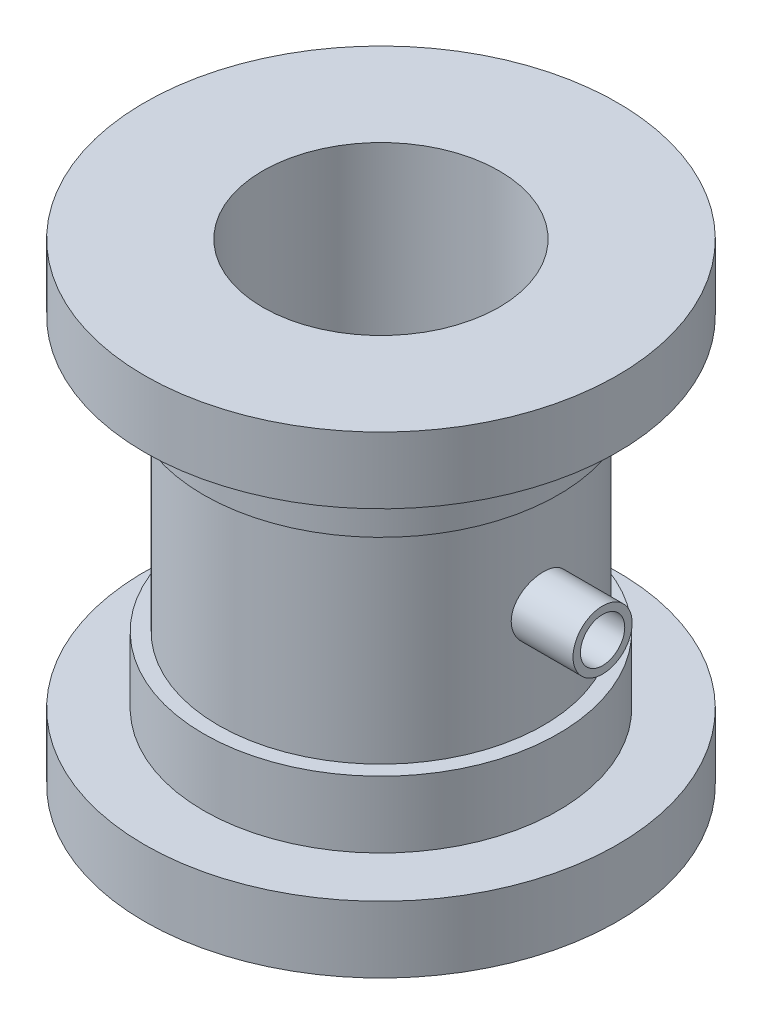
ISO-10303-21;
HEADER;
FILE_DESCRIPTION(('STEP AP214'),'2;1');
FILE_NAME('part.step','',(''),(''),'','','');
FILE_SCHEMA(('AUTOMOTIVE_DESIGN { 1 0 10303 214 1 1 1 1 }'));
ENDSEC;
DATA;
#1=APPLICATION_CONTEXT('core data for automotive mechanical design processes');
#2=APPLICATION_PROTOCOL_DEFINITION('international standard','automotive_design',2000,#1);
#3=PRODUCT_CONTEXT('',#1,'mechanical');
#4=PRODUCT('Part','Part','',(#3));
#5=PRODUCT_RELATED_PRODUCT_CATEGORY('part','',(#4));
#6=PRODUCT_DEFINITION_FORMATION('','',#4);
#7=PRODUCT_DEFINITION_CONTEXT('part definition',#1,'design');
#8=PRODUCT_DEFINITION('design','',#6,#7);
#9=PRODUCT_DEFINITION_SHAPE('','',#8);
#10=(LENGTH_UNIT() NAMED_UNIT(*) SI_UNIT(.MILLI.,.METRE.));
#11=(NAMED_UNIT(*) PLANE_ANGLE_UNIT() SI_UNIT($,.RADIAN.));
#12=(NAMED_UNIT(*) SI_UNIT($,.STERADIAN.) SOLID_ANGLE_UNIT());
#13=UNCERTAINTY_MEASURE_WITH_UNIT(LENGTH_MEASURE(1.E-05),#10,'distance_accuracy_value','');
#14=(GEOMETRIC_REPRESENTATION_CONTEXT(3) GLOBAL_UNCERTAINTY_ASSIGNED_CONTEXT((#13)) GLOBAL_UNIT_ASSIGNED_CONTEXT((#10,
#11,#12)) REPRESENTATION_CONTEXT('',''));
#15=CARTESIAN_POINT('',(0.,0.,0.));
#16=DIRECTION('',(0.,0.,1.));
#17=DIRECTION('',(1.,0.,0.));
#18=AXIS2_PLACEMENT_3D('',#15,#16,#17);
#19=CARTESIAN_POINT('',(0.,28.,0.));
#20=DIRECTION('',(0.,-1.,0.));
#21=DIRECTION('',(0.,0.,-1.));
#22=AXIS2_PLACEMENT_3D('',#19,#20,#21);
#23=CYLINDRICAL_SURFACE('',#22,22.);
#24=CARTESIAN_POINT('',(-21.7944947177034,14.,-3.));
#25=CARTESIAN_POINT('',(-21.7944973125222,14.1676686557939,-2.99999295397829));
#26=CARTESIAN_POINT('',(-21.7964504822141,14.335438885572,-2.98589613516892));
#27=CARTESIAN_POINT('',(-21.8040481680046,14.6663009494034,-2.92988930626152));
#28=CARTESIAN_POINT('',(-21.8096964302678,14.8293878600565,-2.88795106929477));
#29=CARTESIAN_POINT('',(-21.8240329226108,15.1460455710164,-2.77752885626791));
#30=CARTESIAN_POINT('',(-21.8327189725423,15.2996231031868,-2.70906391400626));
#31=CARTESIAN_POINT('',(-21.8521497354893,15.593083937498,-2.54757436301586));
#32=CARTESIAN_POINT('',(-21.8628941262462,15.7329693781315,-2.4545535979434));
#33=CARTESIAN_POINT('',(-21.8853107439761,15.9960291899694,-2.24593261550096));
#34=CARTESIAN_POINT('',(-21.8969880962733,16.1190995206715,-2.13020174404838));
#35=CARTESIAN_POINT('',(-21.9199089625179,16.3441356113716,-1.87972745186893));
#36=CARTESIAN_POINT('',(-21.9311524538967,16.446100274685,-1.74498304377951));
#37=CARTESIAN_POINT('',(-21.9519917823356,16.6264088097933,-1.45964673364285));
#38=CARTESIAN_POINT('',(-21.9615809332171,16.7046577531438,-1.30899431491147));
#39=CARTESIAN_POINT('',(-21.9779746087792,16.8347051362175,-0.996533559622196));
#40=CARTESIAN_POINT('',(-21.9847792556648,16.8865047367613,-0.834725713012597));
#41=CARTESIAN_POINT('',(-21.9948010960819,16.9618700639319,-0.505615027627407));
#42=CARTESIAN_POINT('',(-21.9980403391051,16.9856093917029,-0.338352625202421));
#43=CARTESIAN_POINT('',(-22.0006418160325,17.0047187619281,-0.00218901989865322));
#44=CARTESIAN_POINT('',(-22.0000042297454,17.0000901200993,0.16671210661274));
#45=CARTESIAN_POINT('',(-21.9949416293269,16.9627331448272,0.500176134095491));
#46=CARTESIAN_POINT('',(-21.9905417842193,16.9301915409683,0.664760389901238));
#47=CARTESIAN_POINT('',(-21.9784771616625,16.8382247979685,0.98610996865958));
#48=CARTESIAN_POINT('',(-21.9708123123852,16.7787990673916,1.1428751195119));
#49=CARTESIAN_POINT('',(-21.9530355245634,16.6345555950203,1.44470900216683));
#50=CARTESIAN_POINT('',(-21.9429159096715,16.5496579984127,1.58973910165001));
#51=CARTESIAN_POINT('',(-21.9213599095811,16.356938901094,1.86356465940336));
#52=CARTESIAN_POINT('',(-21.9099234526045,16.2491161505149,1.99235923191069));
#53=CARTESIAN_POINT('',(-21.8869019715346,16.0125639881594,2.23115639122851));
#54=CARTESIAN_POINT('',(-21.8753164955576,15.883671704982,2.34099765683572));
#55=CARTESIAN_POINT('',(-21.8533940433535,15.6091960813263,2.53751386076589));
#56=CARTESIAN_POINT('',(-21.8430570725053,15.4636126689425,2.62418869928229));
#57=CARTESIAN_POINT('',(-21.8248023099056,15.159733098398,2.77192629130127));
#58=CARTESIAN_POINT('',(-21.816885888441,15.0014298032314,2.83297454471217));
#59=CARTESIAN_POINT('',(-21.8043941534575,14.6766859388551,2.92757469616753));
#60=CARTESIAN_POINT('',(-21.7998186470391,14.5102458400451,2.96112818173423));
#61=CARTESIAN_POINT('',(-21.7945626889125,14.1753823129862,2.99956941672119));
#62=CARTESIAN_POINT('',(-21.7938512929769,14.006985496761,3.00468490854897));
#63=CARTESIAN_POINT('',(-21.7963221316711,13.6717371641336,2.98670732293099));
#64=CARTESIAN_POINT('',(-21.7995042670648,13.5048856084559,2.96361496443094));
#65=CARTESIAN_POINT('',(-21.8093753071634,13.1781565348422,2.89006955453774));
#66=CARTESIAN_POINT('',(-21.8160498979624,13.0182534145076,2.83972815512375));
#67=CARTESIAN_POINT('',(-21.8321421092609,12.7091565507405,2.71322912313733));
#68=CARTESIAN_POINT('',(-21.8415598432741,12.5599632508084,2.63707042220062));
#69=CARTESIAN_POINT('',(-21.8621508077798,12.2754947875546,2.46054424209315));
#70=CARTESIAN_POINT('',(-21.8733346554527,12.1403125677473,2.36002824545063));
#71=CARTESIAN_POINT('',(-21.8961649833416,11.8886549951313,2.13784918546698));
#72=CARTESIAN_POINT('',(-21.9078114850387,11.7721805121982,2.01618513932771));
#73=CARTESIAN_POINT('',(-21.9303506440045,11.5604369463813,1.75416517490271));
#74=CARTESIAN_POINT('',(-21.9412376115705,11.465318071075,1.61368731048535));
#75=CARTESIAN_POINT('',(-21.9609445601932,11.3000282219224,1.31861563564173));
#76=CARTESIAN_POINT('',(-21.9697645895377,11.2298566652379,1.1640221551012));
#77=CARTESIAN_POINT('',(-21.9843187797623,11.1166979481429,0.845593617063882));
#78=CARTESIAN_POINT('',(-21.9900625555325,11.0736260127071,0.681789143548597));
#79=CARTESIAN_POINT('',(-21.9978571930975,11.0156139846478,0.349189125621002));
#80=CARTESIAN_POINT('',(-21.9999082547485,11.0006723695607,0.180393851822023));
#81=CARTESIAN_POINT('',(-22.0000849669784,10.9993773344575,-0.15593394479378));
#82=CARTESIAN_POINT('',(-21.9982423123403,11.0127930862346,-0.323465608546993));
#83=CARTESIAN_POINT('',(-21.9909020074537,11.0673405312772,-0.65386852750444));
#84=CARTESIAN_POINT('',(-21.9854043633727,11.1084721777741,-0.816739790572315));
#85=CARTESIAN_POINT('',(-21.9713688879314,11.2172071855912,-1.13315387765859));
#86=CARTESIAN_POINT('',(-21.9628325744139,11.2847973323295,-1.28670131426867));
#87=CARTESIAN_POINT('',(-21.9436616719154,11.4445066044813,-1.58031159285156));
#88=CARTESIAN_POINT('',(-21.9330270390184,11.5366262432889,-1.72037415250692));
#89=CARTESIAN_POINT('',(-21.9107413064255,11.7436255734436,-1.98421472860386));
#90=CARTESIAN_POINT('',(-21.899082951343,11.8586765359164,-2.10785776937319));
#91=CARTESIAN_POINT('',(-21.8761200052605,12.1079137559864,-2.33416948478685));
#92=CARTESIAN_POINT('',(-21.864815498298,12.2421045177904,-2.43683320845295));
#93=CARTESIAN_POINT('',(-21.8437846234674,12.5265296933573,-2.61868613380124));
#94=CARTESIAN_POINT('',(-21.8340657568726,12.6768350915978,-2.69776514213643));
#95=CARTESIAN_POINT('',(-21.817394367016,12.9886475846397,-2.8294429199818));
#96=CARTESIAN_POINT('',(-21.8104388960614,13.1501425264417,-2.88206992162081));
#97=CARTESIAN_POINT('',(-21.8017355288375,13.427022796486,-2.94703203226377));
#98=CARTESIAN_POINT('',(-21.7990341203125,13.5406764223968,-2.96686567785599));
#99=CARTESIAN_POINT('',(-21.7954128315745,13.7695373771214,-2.99335201931175));
#100=CARTESIAN_POINT('',(-21.7944929340268,13.8847446908061,-3.00000484343008));
#101=CARTESIAN_POINT('',(-21.7944947177034,14.,-3.));
#102=B_SPLINE_CURVE_WITH_KNOTS('',3,(#24,#25,#26,#27,#28,#29,#30,#31,#32,#33,#34,#35,#36,#37,
#38,#39,#40,#41,#42,#43,#44,#45,#46,#47,#48,#49,#50,#51,#52,#53,#54,#55,#56,#57,#58,#59,#60,#61,
#62,#63,#64,#65,#66,#67,#68,#69,#70,#71,#72,#73,#74,#75,#76,#77,#78,#79,#80,#81,#82,#83,#84,#85,
#86,#87,#88,#89,#90,#91,#92,#93,#94,#95,#96,#97,#98,#99,#100,#101),.UNSPECIFIED.,.T.,.F.,(4,2,2,
2,2,2,2,2,2,2,2,2,2,2,2,2,2,2,2,2,2,2,2,2,2,2,2,2,2,2,2,2,2,2,2,2,2,2,4),(0.,0.502584827322538,
1.00567997726412,1.50841480614355,2.01107098991681,2.5167086035308,3.02237248429928,
3.5300344705254,4.03767417433728,4.54215653413514,5.04661549603351,5.54772586150296,
6.04884725166254,6.55155638132181,7.05429292546104,7.56111742626901,8.06794411056386,
8.57505718337533,9.08214097388763,9.58515792757104,10.0881620609109,10.5891205844916,
11.0900998411272,11.5942142584276,12.0983521093423,12.6059319233779,13.1134998781727,
13.6194720220333,14.125416780985,14.6272590296531,15.1291004314969,15.6306915099824,
16.1322930874248,16.6377918045005,17.1434096784681,17.6513541852326,18.158755407386,
18.5042352052812,18.8497116414995),.UNSPECIFIED.);
#103=CARTESIAN_POINT('',(-21.7944947177034,14.,-3.));
#104=VERTEX_POINT('',#103);
#105=EDGE_CURVE('E90',#104,#104,#102,.T.);
#106=ORIENTED_EDGE('',*,*,#105,.T.);
#107=EDGE_LOOP('',(#106));
#108=FACE_BOUND('',#107,.T.);
#109=CARTESIAN_POINT('',(0.,28.,0.));
#110=DIRECTION('',(0.,1.,0.));
#111=DIRECTION('',(0.,0.,1.));
#112=AXIS2_PLACEMENT_3D('',#109,#110,#111);
#113=CIRCLE('',#112,22.);
#114=CARTESIAN_POINT('',(0.,28.,22.));
#115=VERTEX_POINT('',#114);
#116=EDGE_CURVE('E41',#115,#115,#113,.T.);
#117=ORIENTED_EDGE('',*,*,#116,.F.);
#118=EDGE_LOOP('',(#117));
#119=FACE_BOUND('',#118,.T.);
#120=CARTESIAN_POINT('',(0.,0.,0.));
#121=DIRECTION('',(0.,1.,0.));
#122=DIRECTION('',(0.,0.,1.));
#123=AXIS2_PLACEMENT_3D('',#120,#121,#122);
#124=CIRCLE('',#123,22.);
#125=CARTESIAN_POINT('',(0.,0.,22.));
#126=VERTEX_POINT('',#125);
#127=EDGE_CURVE('E119',#126,#126,#124,.T.);
#128=ORIENTED_EDGE('',*,*,#127,.T.);
#129=EDGE_LOOP('',(#128));
#130=FACE_BOUND('',#129,.T.);
#131=CARTESIAN_POINT('',(21.6333076527839,14.,4.));
#132=CARTESIAN_POINT('',(21.6333118939645,13.7773197548541,3.99999133497668));
#133=CARTESIAN_POINT('',(21.636783172832,13.554525617424,3.98134200846101));
#134=CARTESIAN_POINT('',(21.650277261808,13.1152107682541,3.907282639324));
#135=CARTESIAN_POINT('',(21.6603057667963,12.8986956806614,3.85184064204138));
#136=CARTESIAN_POINT('',(21.6857418061113,12.478359373963,3.70594738579437));
#137=CARTESIAN_POINT('',(21.7011444752348,12.2745268693839,3.61552778385547));
#138=CARTESIAN_POINT('',(21.7355875966023,11.8849402167421,3.40232850816631));
#139=CARTESIAN_POINT('',(21.7546277295314,11.6991844839672,3.27955167453961));
#140=CARTESIAN_POINT('',(21.7944494758657,11.3488331051165,3.00359049647932));
#141=CARTESIAN_POINT('',(21.8152472612912,11.1844798515321,2.85010070695621));
#142=CARTESIAN_POINT('',(21.8560978635286,10.8837088743311,2.51773079268323));
#143=CARTESIAN_POINT('',(21.8761506327525,10.7472929327092,2.33884904952699));
#144=CARTESIAN_POINT('',(21.9134244798488,10.5053453630995,1.95918683799973));
#145=CARTESIAN_POINT('',(21.930624292806,10.4000414600084,1.75825898095977));
#146=CARTESIAN_POINT('',(21.9600735467303,10.2247733339477,1.34119954887522));
#147=CARTESIAN_POINT('',(21.9723233703801,10.1548063789813,1.12506915065336));
#148=CARTESIAN_POINT('',(21.9903782117666,10.0529455334891,0.686249675641715));
#149=CARTESIAN_POINT('',(21.9962522909049,10.0206433713586,0.463658257037535));
#150=CARTESIAN_POINT('',(22.0011316177893,9.9937576650752,0.0161429459318481));
#151=CARTESIAN_POINT('',(22.0001374169679,9.99917109285692,-0.208780757870077));
#152=CARTESIAN_POINT('',(21.9914463710423,10.0472482841558,-0.651778392281481));
#153=CARTESIAN_POINT('',(21.9838286175382,10.0894725070289,-0.8699018001067));
#154=CARTESIAN_POINT('',(21.9628349381595,10.209278394923,-1.29591498120673));
#155=CARTESIAN_POINT('',(21.949458811838,10.2868612907725,-1.50380439795921));
#156=CARTESIAN_POINT('',(21.9183184074471,10.4756061195583,-1.9047324509077));
#157=CARTESIAN_POINT('',(21.9005310604676,10.5869452880677,-2.09768578503493));
#158=CARTESIAN_POINT('',(21.8625379364345,10.8399117798494,-2.46233526714585));
#159=CARTESIAN_POINT('',(21.8423319276856,10.981542005871,-2.63402937539644));
#160=CARTESIAN_POINT('',(21.8013981618568,11.2934969091586,-2.95388890108789));
#161=CARTESIAN_POINT('',(21.7806670830423,11.464206035838,-3.10167918809898));
#162=CARTESIAN_POINT('',(21.7412992413716,11.8281881278418,-3.36658543928332));
#163=CARTESIAN_POINT('',(21.7226625056581,12.0214613855305,-3.48370100593934));
#164=CARTESIAN_POINT('',(21.6895894681967,12.4255650209737,-3.68403076498185));
#165=CARTESIAN_POINT('',(21.6751596002547,12.6364216632796,-3.76719310770445));
#166=CARTESIAN_POINT('',(21.6522346695387,13.0694348997767,-3.89680753773996));
#167=CARTESIAN_POINT('',(21.6437389774287,13.2915902930223,-3.94326351793351));
#168=CARTESIAN_POINT('',(21.6337680818549,13.7375196024108,-3.99760435703092));
#169=CARTESIAN_POINT('',(21.6321950076555,13.9612258653393,-4.00602696978329));
#170=CARTESIAN_POINT('',(21.6359859030778,14.4068491011222,-3.98550109557699));
#171=CARTESIAN_POINT('',(21.6413495511773,14.6287661564279,-3.95655434071577));
#172=CARTESIAN_POINT('',(21.6583185875735,15.0627606881046,-3.86257219277794));
#173=CARTESIAN_POINT('',(21.6698756001577,15.2749007680161,-3.79781637710752));
#174=CARTESIAN_POINT('',(21.6978878160151,15.6853194376569,-3.63434995143755));
#175=CARTESIAN_POINT('',(21.7143433613546,15.8835970581714,-3.53563697012216));
#176=CARTESIAN_POINT('',(21.7505226830533,16.2630383920305,-3.30581172375987));
#177=CARTESIAN_POINT('',(21.7702800968595,16.4439922361688,-3.17435835883133));
#178=CARTESIAN_POINT('',(21.8107413258404,16.7814673831955,-2.88324609901472));
#179=CARTESIAN_POINT('',(21.8314452207,16.9379866239993,-2.72358482602649));
#180=CARTESIAN_POINT('',(21.8717797209063,17.2241456922996,-2.37819260014522));
#181=CARTESIAN_POINT('',(21.8913936565351,17.3534247107236,-2.19216046504753));
#182=CARTESIAN_POINT('',(21.9270616275553,17.578892612166,-1.80070523958705));
#183=CARTESIAN_POINT('',(21.9431157941211,17.6750827145543,-1.59528286413569));
#184=CARTESIAN_POINT('',(21.9697834526315,17.8310960772729,-1.17189643669068));
#185=CARTESIAN_POINT('',(21.9804239020959,17.8910998097531,-0.954000658707898));
#186=CARTESIAN_POINT('',(21.9951799495618,17.9736146865943,-0.511013297926956));
#187=CARTESIAN_POINT('',(21.9992961913554,17.9961295302734,-0.285922427358459));
#188=CARTESIAN_POINT('',(22.0005282842776,18.002905042211,0.161599238057637));
#189=CARTESIAN_POINT('',(21.9977440646224,17.9877117769694,0.384021675850898));
#190=CARTESIAN_POINT('',(21.9856946780428,17.9206941071521,0.823089077981736));
#191=CARTESIAN_POINT('',(21.9764295654387,17.868870009602,1.03973409072766));
#192=CARTESIAN_POINT('',(21.9524581381546,17.7302861930215,1.46083086688087));
#193=CARTESIAN_POINT('',(21.9377603669599,17.6435813092489,1.6653011932924));
#194=CARTESIAN_POINT('',(21.9045184478405,17.4377611943825,2.05687402388434));
#195=CARTESIAN_POINT('',(21.8859740630709,17.3186439674452,2.2439754575947));
#196=CARTESIAN_POINT('',(21.8467718041457,17.0494847228762,2.59822919507097));
#197=CARTESIAN_POINT('',(21.826088758947,16.8990466092313,2.76507779716897));
#198=CARTESIAN_POINT('',(21.7851034058444,16.5723409666129,3.07135244710173));
#199=CARTESIAN_POINT('',(21.7648011884524,16.3960673828768,3.21077204872679));
#200=CARTESIAN_POINT('',(21.7266856567864,16.0208806487978,3.45935343607217));
#201=CARTESIAN_POINT('',(21.7088952940926,15.8217855213773,3.56824417003713));
#202=CARTESIAN_POINT('',(21.6780923491353,15.407873446548,3.75086117813966));
#203=CARTESIAN_POINT('',(21.6650751844592,15.1930718167844,3.82462119925559));
#204=CARTESIAN_POINT('',(21.6480562150115,14.8146466311355,3.91959792411038));
#205=CARTESIAN_POINT('',(21.642557744208,14.6532614747828,3.94969798379532));
#206=CARTESIAN_POINT('',(21.6351819455147,14.3279380959356,3.98990196850047));
#207=CARTESIAN_POINT('',(21.6333045292318,14.1639999358607,4.00000638163151));
#208=CARTESIAN_POINT('',(21.6333076527839,14.,4.));
#209=B_SPLINE_CURVE_WITH_KNOTS('',3,(#131,#132,#133,#134,#135,#136,#137,#138,#139,#140,#141,
#142,#143,#144,#145,#146,#147,#148,#149,#150,#151,#152,#153,#154,#155,#156,#157,#158,#159,#160,
#161,#162,#163,#164,#165,#166,#167,#168,#169,#170,#171,#172,#173,#174,#175,#176,#177,#178,#179,
#180,#181,#182,#183,#184,#185,#186,#187,#188,#189,#190,#191,#192,#193,#194,#195,#196,#197,#198,
#199,#200,#201,#202,#203,#204,#205,#206,#207,#208),.UNSPECIFIED.,.T.,.F.,(4,2,2,2,2,2,2,2,2,2,2,
2,2,2,2,2,2,2,2,2,2,2,2,2,2,2,2,2,2,2,2,2,2,2,2,2,2,2,4),(0.,0.667440705257541,1.33546184685072,
2.00287979476302,2.67023918023371,3.3445987023052,4.01900122532956,4.69822425023956,
5.3773947545028,6.04913278831927,6.72081689103461,7.38458890585934,8.04838402822076,
8.71572656975959,9.38313309046882,10.0601670169629,10.7372097167831,11.4152824897346,
12.0932833402558,12.7616672929396,13.4300202666519,14.0932273132435,14.7564806826868,
15.4269564046825,16.0974886789026,16.7764104513919,17.4553072020415,18.1307894735074,
18.8062050859725,19.4718969577386,20.1375832499996,20.8022270968082,21.4669118794232,
22.1405775941432,22.8144014413677,23.4940309659146,24.1730063069362,24.6645762030324,
25.1561340993393),.UNSPECIFIED.);
#210=CARTESIAN_POINT('',(21.6333076527839,14.,4.));
#211=VERTEX_POINT('',#210);
#212=EDGE_CURVE('E10',#211,#211,#209,.T.);
#213=ORIENTED_EDGE('',*,*,#212,.F.);
#214=EDGE_LOOP('',(#213));
#215=FACE_BOUND('',#214,.T.);
#216=ADVANCED_FACE('F37',(#108,#119,#130,#215),#23,.T.);
#217=CARTESIAN_POINT('',(0.,-18.,0.));
#218=DIRECTION('',(0.,-1.,0.));
#219=DIRECTION('',(0.,0.,-1.));
#220=AXIS2_PLACEMENT_3D('',#217,#218,#219);
#221=CYLINDRICAL_SURFACE('',#220,16.);
#222=CARTESIAN_POINT('',(-15.7162336455017,14.,-3.));
#223=CARTESIAN_POINT('',(-15.7162368759014,13.8330855839748,-2.99999359766589));
#224=CARTESIAN_POINT('',(-15.7189215952138,13.6660881035627,-2.98602252697898));
#225=CARTESIAN_POINT('',(-15.7293570202788,13.3368020768367,-2.93054506503584));
#226=CARTESIAN_POINT('',(-15.7371120234618,13.1745176471452,-2.88901531536947));
#227=CARTESIAN_POINT('',(-15.7567795292999,12.8594698572581,-2.77974071235582));
#228=CARTESIAN_POINT('',(-15.7686881581205,12.7066977813854,-2.7120202790875));
#229=CARTESIAN_POINT('',(-15.7953165264186,12.4146928814264,-2.5523513152073));
#230=CARTESIAN_POINT('',(-15.8100360465123,12.2754590019934,-2.46040467518386));
#231=CARTESIAN_POINT('',(-15.840832296779,12.0127396016017,-2.25367357885245));
#232=CARTESIAN_POINT('',(-15.8569223325136,11.8894470330565,-2.13864585866183));
#233=CARTESIAN_POINT('',(-15.8885291532806,11.6637912208009,-1.8895435576071));
#234=CARTESIAN_POINT('',(-15.904045900623,11.5614293511504,-1.75546772724989));
#235=CARTESIAN_POINT('',(-15.9329003565681,11.379801246799,-1.47080778914032));
#236=CARTESIAN_POINT('',(-15.9462205610473,11.3007169329612,-1.32010568006773));
#237=CARTESIAN_POINT('',(-15.9690321726586,11.1690609154529,-1.00726256650152));
#238=CARTESIAN_POINT('',(-15.9785238945667,11.1164870320196,-0.845122503719009));
#239=CARTESIAN_POINT('',(-15.9925151024756,11.0399409027777,-0.51600549237483));
#240=CARTESIAN_POINT('',(-15.9970713195265,11.0156433881546,-0.349106646489712));
#241=CARTESIAN_POINT('',(-16.0008736923119,10.9953262245992,-0.0135433520707643));
#242=CARTESIAN_POINT('',(-16.0001203002139,10.9993041677219,0.155120944895342));
#243=CARTESIAN_POINT('',(-15.9934326752648,11.0351755422943,0.487196715798795));
#244=CARTESIAN_POINT('',(-15.9875634449443,11.06671873886,0.65064752090294));
#245=CARTESIAN_POINT('',(-15.9713765266712,11.1562712987905,0.969894331430953));
#246=CARTESIAN_POINT('',(-15.9610586765993,11.2142816266916,1.12569005765308));
#247=CARTESIAN_POINT('',(-15.9370252059468,11.3554554621166,1.42622013150304));
#248=CARTESIAN_POINT('',(-15.9232907518165,11.438758975825,1.57088714367707));
#249=CARTESIAN_POINT('',(-15.893942950857,11.6280513381543,1.84431995442928));
#250=CARTESIAN_POINT('',(-15.8783294130233,11.7340424937752,1.97308413382157));
#251=CARTESIAN_POINT('',(-15.8466702736113,11.9676314059671,2.21313123793808));
#252=CARTESIAN_POINT('',(-15.8306217180324,12.0955355678042,2.32411581514082));
#253=CARTESIAN_POINT('',(-15.8001301784924,12.3682990625573,2.52310343702521));
#254=CARTESIAN_POINT('',(-15.785687218027,12.5131586435293,2.61110614542364));
#255=CARTESIAN_POINT('',(-15.7600378661424,12.8161165414053,2.76171704448955));
#256=CARTESIAN_POINT('',(-15.7488370106052,12.9742369143813,2.82428187290843));
#257=CARTESIAN_POINT('',(-15.7310248479338,13.2990023682464,2.92187313950112));
#258=CARTESIAN_POINT('',(-15.7244130207724,13.4656464809296,2.95690269802216));
#259=CARTESIAN_POINT('',(-15.7166304060201,13.8000386577118,2.99799345299478));
#260=CARTESIAN_POINT('',(-15.7153791163227,13.967732231131,3.00448328571717));
#261=CARTESIAN_POINT('',(-15.7182438284168,14.3018069101743,2.98945937763449));
#262=CARTESIAN_POINT('',(-15.7223595647722,14.4681880802962,2.96794702172866));
#263=CARTESIAN_POINT('',(-15.7354196012641,14.7935058061088,2.89789736391765));
#264=CARTESIAN_POINT('',(-15.7443237338176,14.9524925052498,2.84958477167979));
#265=CARTESIAN_POINT('',(-15.7659226831324,15.2601143794603,2.7275444875812));
#266=CARTESIAN_POINT('',(-15.7786177792656,15.4087487906307,2.6538149225759));
#267=CARTESIAN_POINT('',(-15.8065515572737,15.6933352380863,2.4820470623932));
#268=CARTESIAN_POINT('',(-15.8218179085063,15.8291210757321,2.38373799279242));
#269=CARTESIAN_POINT('',(-15.853096227362,16.0824240804287,2.16596688688493));
#270=CARTESIAN_POINT('',(-15.8691082619299,16.1999396031115,2.04650294866167));
#271=CARTESIAN_POINT('',(-15.9003324801189,16.4149675270683,1.78789883574077));
#272=CARTESIAN_POINT('',(-15.9155311166661,16.5121916532119,1.64851706819178));
#273=CARTESIAN_POINT('',(-15.943188096207,16.6818424123553,1.35514904608028));
#274=CARTESIAN_POINT('',(-15.9556465446945,16.75427000005,1.20116335407705));
#275=CARTESIAN_POINT('',(-15.9763611599169,16.8718401957282,0.883755083157366));
#276=CARTESIAN_POINT('',(-15.9846390946028,16.9171243751228,0.720386426157975));
#277=CARTESIAN_POINT('',(-15.9961528416749,16.9795740965798,0.388192454763138));
#278=CARTESIAN_POINT('',(-15.9993891845988,16.9967425973254,0.219367716431694));
#279=CARTESIAN_POINT('',(-16.0004445503086,17.0023706030369,-0.116181520501014));
#280=CARTESIAN_POINT('',(-15.9983457325,16.9912655062591,-0.282898614132516));
#281=CARTESIAN_POINT('',(-15.9891373322347,16.9416151444631,-0.612046738558423));
#282=CARTESIAN_POINT('',(-15.9820277978157,16.9030701425114,-0.774477810427463));
#283=CARTESIAN_POINT('',(-15.9635967595586,16.7998175852327,-1.09021295119089));
#284=CARTESIAN_POINT('',(-15.9522827196228,16.7351563742386,-1.24353263863614));
#285=CARTESIAN_POINT('',(-15.9266674413841,16.5815590926891,-1.5372112626337));
#286=CARTESIAN_POINT('',(-15.912366002962,16.4926213957845,-1.67756933000769));
#287=CARTESIAN_POINT('',(-15.882095597166,16.2914970911175,-1.94351005555884));
#288=CARTESIAN_POINT('',(-15.8661056917023,16.1789959322848,-2.06885247077667));
#289=CARTESIAN_POINT('',(-15.8343926708998,15.9345908750064,-2.2990307213141));
#290=CARTESIAN_POINT('',(-15.8186696191953,15.8026824192219,-2.40386172651201));
#291=CARTESIAN_POINT('',(-15.7891115480538,15.5217470906199,-2.59095267889405));
#292=CARTESIAN_POINT('',(-15.7752953438736,15.3725731207714,-2.67299481058047));
#293=CARTESIAN_POINT('',(-15.7513416912985,15.0623484201479,-2.81072264841151));
#294=CARTESIAN_POINT('',(-15.7412007725928,14.9013090668493,-2.86643323276462));
#295=CARTESIAN_POINT('',(-15.7278603261272,14.6164954238523,-2.9385945319323));
#296=CARTESIAN_POINT('',(-15.7235262144357,14.4943885524718,-2.96158211479939));
#297=CARTESIAN_POINT('',(-15.7177117118331,14.2482030631637,-2.99228702152192));
#298=CARTESIAN_POINT('',(-15.7162312432422,14.1241244990007,-3.00000476104182));
#299=CARTESIAN_POINT('',(-15.7162336455017,14.,-3.));
#300=B_SPLINE_CURVE_WITH_KNOTS('',3,(#222,#223,#224,#225,#226,#227,#228,#229,#230,#231,#232,
#233,#234,#235,#236,#237,#238,#239,#240,#241,#242,#243,#244,#245,#246,#247,#248,#249,#250,#251,
#252,#253,#254,#255,#256,#257,#258,#259,#260,#261,#262,#263,#264,#265,#266,#267,#268,#269,#270,
#271,#272,#273,#274,#275,#276,#277,#278,#279,#280,#281,#282,#283,#284,#285,#286,#287,#288,#289,
#290,#291,#292,#293,#294,#295,#296,#297,#298,#299),.UNSPECIFIED.,.T.,.F.,(4,2,2,2,2,2,2,2,2,2,2,
2,2,2,2,2,2,2,2,2,2,2,2,2,2,2,2,2,2,2,2,2,2,2,2,2,2,2,4),(0.,0.500289011586372,1.00100260476079,
1.50125045595686,2.00145927987816,2.50724671397382,3.0130673413863,3.52274208696095,
4.03237491879281,4.53608550920522,5.03975320401296,5.53711301197449,6.03449094656849,
6.53467383968438,7.03490761823571,7.54281229528129,8.050724403848,8.55949872236533,
9.06821537732975,9.5692649717415,10.0702897867744,10.5671758463074,11.0640985324863,
11.5667572530829,12.0694611878935,12.5788825099174,13.0882842164341,13.5950053883737,
14.1016732333466,14.6005860114028,15.0994940064433,15.5975205306072,16.0955804271422,
16.6007692801749,17.1060769546153,17.6160600363782,18.1255603150176,18.4976061505795,
18.8696418584437),.UNSPECIFIED.);
#301=CARTESIAN_POINT('',(-15.7162336455017,14.,-3.));
#302=VERTEX_POINT('',#301);
#303=EDGE_CURVE('E85',#302,#302,#300,.T.);
#304=ORIENTED_EDGE('',*,*,#303,.T.);
#305=EDGE_LOOP('',(#304));
#306=FACE_BOUND('',#305,.T.);
#307=CARTESIAN_POINT('',(15.7162336455017,14.,-3.));
#308=CARTESIAN_POINT('',(15.7162368759014,14.1669144160252,-2.99999359766589));
#309=CARTESIAN_POINT('',(15.7189215952138,14.3339118964373,-2.98602252697898));
#310=CARTESIAN_POINT('',(15.7293570202788,14.6631979231633,-2.93054506503584));
#311=CARTESIAN_POINT('',(15.7371120234618,14.8254823528548,-2.88901531536947));
#312=CARTESIAN_POINT('',(15.7567795292999,15.1405301427419,-2.77974071235582));
#313=CARTESIAN_POINT('',(15.7686881581205,15.2933022186146,-2.7120202790875));
#314=CARTESIAN_POINT('',(15.7953165264186,15.5853071185736,-2.5523513152073));
#315=CARTESIAN_POINT('',(15.8100360465123,15.7245409980066,-2.46040467518386));
#316=CARTESIAN_POINT('',(15.840832296779,15.9872603983983,-2.25367357885245));
#317=CARTESIAN_POINT('',(15.8569223325136,16.1105529669435,-2.13864585866183));
#318=CARTESIAN_POINT('',(15.8885291532806,16.3362087791991,-1.8895435576071));
#319=CARTESIAN_POINT('',(15.904045900623,16.4385706488496,-1.75546772724989));
#320=CARTESIAN_POINT('',(15.9329003565681,16.620198753201,-1.47080778914032));
#321=CARTESIAN_POINT('',(15.9462205610473,16.6992830670388,-1.32010568006773));
#322=CARTESIAN_POINT('',(15.9690321726586,16.8309390845471,-1.00726256650152));
#323=CARTESIAN_POINT('',(15.9785238945667,16.8835129679804,-0.84512250371901));
#324=CARTESIAN_POINT('',(15.9925151024756,16.9600590972223,-0.51600549237483));
#325=CARTESIAN_POINT('',(15.9970713195265,16.9843566118454,-0.349106646489713));
#326=CARTESIAN_POINT('',(16.0008736923119,17.0046737754008,-0.0135433520707646));
#327=CARTESIAN_POINT('',(16.0001203002139,17.0006958322781,0.155120944895342));
#328=CARTESIAN_POINT('',(15.9934326752648,16.9648244577057,0.487196715798795));
#329=CARTESIAN_POINT('',(15.9875634449443,16.93328126114,0.650647520902941));
#330=CARTESIAN_POINT('',(15.9713765266712,16.8437287012095,0.969894331430953));
#331=CARTESIAN_POINT('',(15.9610586765993,16.7857183733084,1.12569005765308));
#332=CARTESIAN_POINT('',(15.9370252059468,16.6445445378834,1.42622013150304));
#333=CARTESIAN_POINT('',(15.9232907518165,16.561241024175,1.57088714367707));
#334=CARTESIAN_POINT('',(15.893942950857,16.3719486618457,1.84431995442928));
#335=CARTESIAN_POINT('',(15.8783294130233,16.2659575062248,1.97308413382157));
#336=CARTESIAN_POINT('',(15.8466702736113,16.0323685940329,2.21313123793808));
#337=CARTESIAN_POINT('',(15.8306217180324,15.9044644321959,2.32411581514082));
#338=CARTESIAN_POINT('',(15.8001301784924,15.6317009374427,2.52310343702521));
#339=CARTESIAN_POINT('',(15.785687218027,15.4868413564707,2.61110614542364));
#340=CARTESIAN_POINT('',(15.7600378661424,15.1838834585947,2.76171704448955));
#341=CARTESIAN_POINT('',(15.7488370106052,15.0257630856187,2.82428187290843));
#342=CARTESIAN_POINT('',(15.7310248479338,14.7009976317536,2.92187313950112));
#343=CARTESIAN_POINT('',(15.7244130207724,14.5343535190704,2.95690269802216));
#344=CARTESIAN_POINT('',(15.7166304060201,14.1999613422882,2.99799345299478));
#345=CARTESIAN_POINT('',(15.7153791163227,14.032267768869,3.00448328571717));
#346=CARTESIAN_POINT('',(15.7182438284168,13.6981930898257,2.98945937763449));
#347=CARTESIAN_POINT('',(15.7223595647722,13.5318119197038,2.96794702172866));
#348=CARTESIAN_POINT('',(15.7354196012641,13.2064941938912,2.89789736391765));
#349=CARTESIAN_POINT('',(15.7443237338176,13.0475074947502,2.84958477167979));
#350=CARTESIAN_POINT('',(15.7659226831324,12.7398856205397,2.7275444875812));
#351=CARTESIAN_POINT('',(15.7786177792656,12.5912512093693,2.6538149225759));
#352=CARTESIAN_POINT('',(15.8065515572737,12.3066647619137,2.4820470623932));
#353=CARTESIAN_POINT('',(15.8218179085063,12.1708789242679,2.38373799279242));
#354=CARTESIAN_POINT('',(15.853096227362,11.9175759195713,2.16596688688493));
#355=CARTESIAN_POINT('',(15.8691082619299,11.8000603968885,2.04650294866167));
#356=CARTESIAN_POINT('',(15.9003324801189,11.5850324729317,1.78789883574077));
#357=CARTESIAN_POINT('',(15.9155311166661,11.4878083467881,1.64851706819178));
#358=CARTESIAN_POINT('',(15.943188096207,11.3181575876447,1.35514904608028));
#359=CARTESIAN_POINT('',(15.9556465446945,11.24572999995,1.20116335407706));
#360=CARTESIAN_POINT('',(15.9763611599169,11.1281598042718,0.883755083157368));
#361=CARTESIAN_POINT('',(15.9846390946028,11.0828756248772,0.720386426157976));
#362=CARTESIAN_POINT('',(15.9961528416749,11.0204259034202,0.388192454763138));
#363=CARTESIAN_POINT('',(15.9993891845988,11.0032574026746,0.219367716431695));
#364=CARTESIAN_POINT('',(16.0004445503086,10.9976293969631,-0.116181520501013));
#365=CARTESIAN_POINT('',(15.9983457325,11.0087344937409,-0.282898614132515));
#366=CARTESIAN_POINT('',(15.9891373322347,11.0583848555369,-0.612046738558422));
#367=CARTESIAN_POINT('',(15.9820277978157,11.0969298574886,-0.774477810427463));
#368=CARTESIAN_POINT('',(15.9635967595586,11.2001824147673,-1.09021295119089));
#369=CARTESIAN_POINT('',(15.9522827196228,11.2648436257614,-1.24353263863614));
#370=CARTESIAN_POINT('',(15.9266674413841,11.4184409073109,-1.5372112626337));
#371=CARTESIAN_POINT('',(15.912366002962,11.5073786042155,-1.67756933000769));
#372=CARTESIAN_POINT('',(15.882095597166,11.7085029088825,-1.94351005555884));
#373=CARTESIAN_POINT('',(15.8661056917023,11.8210040677152,-2.06885247077667));
#374=CARTESIAN_POINT('',(15.8343926708998,12.0654091249936,-2.2990307213141));
#375=CARTESIAN_POINT('',(15.8186696191953,12.1973175807781,-2.40386172651201));
#376=CARTESIAN_POINT('',(15.7891115480538,12.4782529093801,-2.59095267889405));
#377=CARTESIAN_POINT('',(15.7752953438736,12.6274268792286,-2.67299481058047));
#378=CARTESIAN_POINT('',(15.7513416912985,12.9376515798521,-2.81072264841151));
#379=CARTESIAN_POINT('',(15.7412007725928,13.0986909331507,-2.86643323276462));
#380=CARTESIAN_POINT('',(15.7278603261272,13.3835045761477,-2.9385945319323));
#381=CARTESIAN_POINT('',(15.7235262144357,13.5056114475282,-2.96158211479939));
#382=CARTESIAN_POINT('',(15.7177117118331,13.7517969368363,-2.99228702152192));
#383=CARTESIAN_POINT('',(15.7162312432422,13.8758755009993,-3.00000476104182));
#384=CARTESIAN_POINT('',(15.7162336455017,14.,-3.));
#385=B_SPLINE_CURVE_WITH_KNOTS('',3,(#307,#308,#309,#310,#311,#312,#313,#314,#315,#316,#317,
#318,#319,#320,#321,#322,#323,#324,#325,#326,#327,#328,#329,#330,#331,#332,#333,#334,#335,#336,
#337,#338,#339,#340,#341,#342,#343,#344,#345,#346,#347,#348,#349,#350,#351,#352,#353,#354,#355,
#356,#357,#358,#359,#360,#361,#362,#363,#364,#365,#366,#367,#368,#369,#370,#371,#372,#373,#374,
#375,#376,#377,#378,#379,#380,#381,#382,#383,#384),.UNSPECIFIED.,.T.,.F.,(4,2,2,2,2,2,2,2,2,2,2,
2,2,2,2,2,2,2,2,2,2,2,2,2,2,2,2,2,2,2,2,2,2,2,2,2,2,2,4),(0.,0.500289011586372,1.00100260476079,
1.50125045595686,2.00145927987816,2.50724671397382,3.0130673413863,3.52274208696095,
4.03237491879281,4.53608550920522,5.03975320401297,5.53711301197449,6.03449094656849,
6.53467383968438,7.03490761823571,7.54281229528129,8.050724403848,8.55949872236533,
9.06821537732975,9.5692649717415,10.0702897867744,10.5671758463074,11.0640985324863,
11.5667572530829,12.0694611878935,12.5788825099174,13.0882842164341,13.5950053883737,
14.1016732333466,14.6005860114028,15.0994940064433,15.5975205306072,16.0955804271422,
16.6007692801749,17.1060769546153,17.6160600363782,18.1255603150176,18.4976061505795,
18.8696418584437),.UNSPECIFIED.);
#386=CARTESIAN_POINT('',(15.7162336455017,14.,-3.));
#387=VERTEX_POINT('',#386);
#388=EDGE_CURVE('E79',#387,#387,#385,.T.);
#389=ORIENTED_EDGE('',*,*,#388,.T.);
#390=EDGE_LOOP('',(#389));
#391=FACE_BOUND('',#390,.T.);
#392=CARTESIAN_POINT('',(0.,46.,0.));
#393=DIRECTION('',(0.,-1.,0.));
#394=DIRECTION('',(0.,0.,-1.));
#395=AXIS2_PLACEMENT_3D('',#392,#393,#394);
#396=CIRCLE('',#395,16.);
#397=CARTESIAN_POINT('',(0.,46.,-16.));
#398=VERTEX_POINT('',#397);
#399=EDGE_CURVE('E184',#398,#398,#396,.T.);
#400=ORIENTED_EDGE('',*,*,#399,.F.);
#401=EDGE_LOOP('',(#400));
#402=FACE_BOUND('',#401,.T.);
#403=CARTESIAN_POINT('',(0.,-18.,0.));
#404=DIRECTION('',(0.,-1.,0.));
#405=DIRECTION('',(0.,0.,-1.));
#406=AXIS2_PLACEMENT_3D('',#403,#404,#405);
#407=CIRCLE('',#406,16.);
#408=CARTESIAN_POINT('',(0.,-18.,-16.));
#409=VERTEX_POINT('',#408);
#410=EDGE_CURVE('E58',#409,#409,#407,.T.);
#411=ORIENTED_EDGE('',*,*,#410,.T.);
#412=EDGE_LOOP('',(#411));
#413=FACE_BOUND('',#412,.T.);
#414=ADVANCED_FACE('F69',(#306,#391,#402,#413),#221,.F.);
#415=CARTESIAN_POINT('',(0.,37.,0.));
#416=DIRECTION('',(0.,-1.,0.));
#417=DIRECTION('',(0.,0.,-1.));
#418=AXIS2_PLACEMENT_3D('',#415,#416,#417);
#419=CYLINDRICAL_SURFACE('',#418,24.);
#420=CARTESIAN_POINT('',(0.,37.,0.));
#421=DIRECTION('',(0.,1.,0.));
#422=DIRECTION('',(0.,0.,1.));
#423=AXIS2_PLACEMENT_3D('',#420,#421,#422);
#424=CIRCLE('',#423,24.);
#425=CARTESIAN_POINT('',(0.,37.,24.));
#426=VERTEX_POINT('',#425);
#427=EDGE_CURVE('E49',#426,#426,#424,.T.);
#428=ORIENTED_EDGE('',*,*,#427,.F.);
#429=EDGE_LOOP('',(#428));
#430=FACE_BOUND('',#429,.T.);
#431=CARTESIAN_POINT('',(0.,28.,0.));
#432=DIRECTION('',(0.,1.,0.));
#433=DIRECTION('',(0.,0.,1.));
#434=AXIS2_PLACEMENT_3D('',#431,#432,#433);
#435=CIRCLE('',#434,24.);
#436=CARTESIAN_POINT('',(0.,28.,24.));
#437=VERTEX_POINT('',#436);
#438=EDGE_CURVE('E133',#437,#437,#435,.T.);
#439=ORIENTED_EDGE('',*,*,#438,.T.);
#440=EDGE_LOOP('',(#439));
#441=FACE_BOUND('',#440,.T.);
#442=ADVANCED_FACE('F73',(#430,#441),#419,.T.);
#443=CARTESIAN_POINT('',(0.,28.,0.));
#444=DIRECTION('',(0.,1.,0.));
#445=DIRECTION('',(0.,0.,1.));
#446=AXIS2_PLACEMENT_3D('',#443,#444,#445);
#447=PLANE('',#446);
#448=ORIENTED_EDGE('',*,*,#116,.T.);
#449=EDGE_LOOP('',(#448));
#450=FACE_BOUND('',#449,.T.);
#451=ORIENTED_EDGE('',*,*,#438,.F.);
#452=EDGE_LOOP('',(#451));
#453=FACE_BOUND('',#452,.T.);
#454=ADVANCED_FACE('F140',(#450,#453),#447,.F.);
#455=CARTESIAN_POINT('',(0.,46.,0.));
#456=DIRECTION('',(0.,-1.,0.));
#457=DIRECTION('',(0.,0.,-1.));
#458=AXIS2_PLACEMENT_3D('',#455,#456,#457);
#459=CYLINDRICAL_SURFACE('',#458,32.);
#460=CARTESIAN_POINT('',(0.,46.,0.));
#461=DIRECTION('',(0.,1.,0.));
#462=DIRECTION('',(0.,0.,1.));
#463=AXIS2_PLACEMENT_3D('',#460,#461,#462);
#464=CIRCLE('',#463,32.);
#465=CARTESIAN_POINT('',(0.,46.,32.));
#466=VERTEX_POINT('',#465);
#467=EDGE_CURVE('E125',#466,#466,#464,.T.);
#468=ORIENTED_EDGE('',*,*,#467,.F.);
#469=EDGE_LOOP('',(#468));
#470=FACE_BOUND('',#469,.T.);
#471=CARTESIAN_POINT('',(0.,37.,0.));
#472=DIRECTION('',(0.,1.,0.));
#473=DIRECTION('',(0.,0.,1.));
#474=AXIS2_PLACEMENT_3D('',#471,#472,#473);
#475=CIRCLE('',#474,32.);
#476=CARTESIAN_POINT('',(0.,37.,32.));
#477=VERTEX_POINT('',#476);
#478=EDGE_CURVE('E121',#477,#477,#475,.T.);
#479=ORIENTED_EDGE('',*,*,#478,.T.);
#480=EDGE_LOOP('',(#479));
#481=FACE_BOUND('',#480,.T.);
#482=ADVANCED_FACE('F142',(#470,#481),#459,.T.);
#483=CARTESIAN_POINT('',(0.,46.,0.));
#484=DIRECTION('',(0.,1.,0.));
#485=DIRECTION('',(0.,0.,1.));
#486=AXIS2_PLACEMENT_3D('',#483,#484,#485);
#487=PLANE('',#486);
#488=ORIENTED_EDGE('',*,*,#399,.T.);
#489=EDGE_LOOP('',(#488));
#490=FACE_BOUND('',#489,.T.);
#491=ORIENTED_EDGE('',*,*,#467,.T.);
#492=EDGE_LOOP('',(#491));
#493=FACE_BOUND('',#492,.T.);
#494=ADVANCED_FACE('F149',(#490,#493),#487,.T.);
#495=CARTESIAN_POINT('',(0.,37.,0.));
#496=DIRECTION('',(0.,1.,0.));
#497=DIRECTION('',(0.,0.,1.));
#498=AXIS2_PLACEMENT_3D('',#495,#496,#497);
#499=PLANE('',#498);
#500=ORIENTED_EDGE('',*,*,#427,.T.);
#501=EDGE_LOOP('',(#500));
#502=FACE_BOUND('',#501,.T.);
#503=ORIENTED_EDGE('',*,*,#478,.F.);
#504=EDGE_LOOP('',(#503));
#505=FACE_BOUND('',#504,.T.);
#506=ADVANCED_FACE('F154',(#502,#505),#499,.F.);
#507=CARTESIAN_POINT('',(0.,-9.,0.));
#508=DIRECTION('',(0.,1.,0.));
#509=DIRECTION('',(0.,0.,-1.));
#510=AXIS2_PLACEMENT_3D('',#507,#508,#509);
#511=CYLINDRICAL_SURFACE('',#510,24.);
#512=CARTESIAN_POINT('',(0.,-9.,0.));
#513=DIRECTION('',(0.,1.,0.));
#514=DIRECTION('',(0.,0.,1.));
#515=AXIS2_PLACEMENT_3D('',#512,#513,#514);
#516=CIRCLE('',#515,24.);
#517=CARTESIAN_POINT('',(0.,-9.,24.));
#518=VERTEX_POINT('',#517);
#519=EDGE_CURVE('E122',#518,#518,#516,.T.);
#520=ORIENTED_EDGE('',*,*,#519,.T.);
#521=EDGE_LOOP('',(#520));
#522=FACE_BOUND('',#521,.T.);
#523=CARTESIAN_POINT('',(0.,0.,0.));
#524=DIRECTION('',(0.,1.,0.));
#525=DIRECTION('',(0.,0.,1.));
#526=AXIS2_PLACEMENT_3D('',#523,#524,#525);
#527=CIRCLE('',#526,24.);
#528=CARTESIAN_POINT('',(0.,0.,24.));
#529=VERTEX_POINT('',#528);
#530=EDGE_CURVE('E128',#529,#529,#527,.T.);
#531=ORIENTED_EDGE('',*,*,#530,.F.);
#532=EDGE_LOOP('',(#531));
#533=FACE_BOUND('',#532,.T.);
#534=ADVANCED_FACE('F157',(#522,#533),#511,.T.);
#535=CARTESIAN_POINT('',(0.,0.,0.));
#536=DIRECTION('',(0.,-1.,0.));
#537=DIRECTION('',(0.,0.,1.));
#538=AXIS2_PLACEMENT_3D('',#535,#536,#537);
#539=PLANE('',#538);
#540=ORIENTED_EDGE('',*,*,#127,.F.);
#541=EDGE_LOOP('',(#540));
#542=FACE_BOUND('',#541,.T.);
#543=ORIENTED_EDGE('',*,*,#530,.T.);
#544=EDGE_LOOP('',(#543));
#545=FACE_BOUND('',#544,.T.);
#546=ADVANCED_FACE('F164',(#542,#545),#539,.F.);
#547=CARTESIAN_POINT('',(0.,-18.,0.));
#548=DIRECTION('',(0.,1.,0.));
#549=DIRECTION('',(0.,0.,-1.));
#550=AXIS2_PLACEMENT_3D('',#547,#548,#549);
#551=CYLINDRICAL_SURFACE('',#550,32.);
#552=CARTESIAN_POINT('',(0.,-18.,0.));
#553=DIRECTION('',(0.,1.,0.));
#554=DIRECTION('',(0.,0.,1.));
#555=AXIS2_PLACEMENT_3D('',#552,#553,#554);
#556=CIRCLE('',#555,32.);
#557=CARTESIAN_POINT('',(0.,-18.,32.));
#558=VERTEX_POINT('',#557);
#559=EDGE_CURVE('E183',#558,#558,#556,.T.);
#560=ORIENTED_EDGE('',*,*,#559,.T.);
#561=EDGE_LOOP('',(#560));
#562=FACE_BOUND('',#561,.T.);
#563=CARTESIAN_POINT('',(0.,-9.,0.));
#564=DIRECTION('',(0.,1.,0.));
#565=DIRECTION('',(0.,0.,1.));
#566=AXIS2_PLACEMENT_3D('',#563,#564,#565);
#567=CIRCLE('',#566,32.);
#568=CARTESIAN_POINT('',(0.,-9.,32.));
#569=VERTEX_POINT('',#568);
#570=EDGE_CURVE('E181',#569,#569,#567,.T.);
#571=ORIENTED_EDGE('',*,*,#570,.F.);
#572=EDGE_LOOP('',(#571));
#573=FACE_BOUND('',#572,.T.);
#574=ADVANCED_FACE('F168',(#562,#573),#551,.T.);
#575=CARTESIAN_POINT('',(0.,-18.,0.));
#576=DIRECTION('',(0.,-1.,0.));
#577=DIRECTION('',(0.,0.,1.));
#578=AXIS2_PLACEMENT_3D('',#575,#576,#577);
#579=PLANE('',#578);
#580=ORIENTED_EDGE('',*,*,#410,.F.);
#581=EDGE_LOOP('',(#580));
#582=FACE_BOUND('',#581,.T.);
#583=ORIENTED_EDGE('',*,*,#559,.F.);
#584=EDGE_LOOP('',(#583));
#585=FACE_BOUND('',#584,.T.);
#586=ADVANCED_FACE('F75',(#582,#585),#579,.T.);
#587=CARTESIAN_POINT('',(0.,-9.,0.));
#588=DIRECTION('',(0.,-1.,0.));
#589=DIRECTION('',(0.,0.,1.));
#590=AXIS2_PLACEMENT_3D('',#587,#588,#589);
#591=PLANE('',#590);
#592=ORIENTED_EDGE('',*,*,#519,.F.);
#593=EDGE_LOOP('',(#592));
#594=FACE_BOUND('',#593,.T.);
#595=ORIENTED_EDGE('',*,*,#570,.T.);
#596=EDGE_LOOP('',(#595));
#597=FACE_BOUND('',#596,.T.);
#598=ADVANCED_FACE('F66',(#594,#597),#591,.F.);
#599=CARTESIAN_POINT('',(30.,14.,0.));
#600=DIRECTION('',(-1.,0.,0.));
#601=DIRECTION('',(0.,0.,1.));
#602=AXIS2_PLACEMENT_3D('',#599,#600,#601);
#603=CYLINDRICAL_SURFACE('',#602,4.);
#604=CARTESIAN_POINT('',(30.,14.,0.));
#605=DIRECTION('',(1.,0.,0.));
#606=DIRECTION('',(0.,0.,-1.));
#607=AXIS2_PLACEMENT_3D('',#604,#605,#606);
#608=CIRCLE('',#607,4.);
#609=CARTESIAN_POINT('',(30.,14.,-4.));
#610=VERTEX_POINT('',#609);
#611=EDGE_CURVE('E56',#610,#610,#608,.T.);
#612=ORIENTED_EDGE('',*,*,#611,.F.);
#613=EDGE_LOOP('',(#612));
#614=FACE_BOUND('',#613,.T.);
#615=ORIENTED_EDGE('',*,*,#212,.T.);
#616=EDGE_LOOP('',(#615));
#617=FACE_BOUND('',#616,.T.);
#618=ADVANCED_FACE('F60',(#614,#617),#603,.T.);
#619=CARTESIAN_POINT('',(30.,0.,0.));
#620=DIRECTION('',(1.,0.,0.));
#621=DIRECTION('',(0.,0.,-1.));
#622=AXIS2_PLACEMENT_3D('',#619,#620,#621);
#623=PLANE('',#622);
#624=CARTESIAN_POINT('',(30.,14.,0.));
#625=DIRECTION('',(1.,0.,0.));
#626=DIRECTION('',(0.,0.,-1.));
#627=AXIS2_PLACEMENT_3D('',#624,#625,#626);
#628=CIRCLE('',#627,3.);
#629=CARTESIAN_POINT('',(30.,14.,-3.));
#630=VERTEX_POINT('',#629);
#631=EDGE_CURVE('E202',#630,#630,#628,.T.);
#632=ORIENTED_EDGE('',*,*,#631,.F.);
#633=EDGE_LOOP('',(#632));
#634=FACE_BOUND('',#633,.T.);
#635=ORIENTED_EDGE('',*,*,#611,.T.);
#636=EDGE_LOOP('',(#635));
#637=FACE_BOUND('',#636,.T.);
#638=ADVANCED_FACE('F65',(#634,#637),#623,.T.);
#639=CARTESIAN_POINT('',(-32.,14.,0.));
#640=DIRECTION('',(1.,0.,0.));
#641=DIRECTION('',(0.,0.,-1.));
#642=AXIS2_PLACEMENT_3D('',#639,#640,#641);
#643=CYLINDRICAL_SURFACE('',#642,3.);
#644=ORIENTED_EDGE('',*,*,#631,.T.);
#645=EDGE_LOOP('',(#644));
#646=FACE_BOUND('',#645,.T.);
#647=ORIENTED_EDGE('',*,*,#388,.F.);
#648=EDGE_LOOP('',(#647));
#649=FACE_BOUND('',#648,.T.);
#650=ADVANCED_FACE('F97',(#646,#649),#643,.F.);
#651=ORIENTED_EDGE('',*,*,#303,.F.);
#652=EDGE_LOOP('',(#651));
#653=FACE_BOUND('',#652,.T.);
#654=ORIENTED_EDGE('',*,*,#105,.F.);
#655=EDGE_LOOP('',(#654));
#656=FACE_BOUND('',#655,.T.);
#657=ADVANCED_FACE('F94',(#653,#656),#643,.F.);
#658=CLOSED_SHELL('',(#216,#414,#442,#454,#482,#494,#506,#534,#546,#574,#586,#598,#618,#638,
#650,#657));
#659=MANIFOLD_SOLID_BREP('B2',#658);
#660=ADVANCED_BREP_SHAPE_REPRESENTATION('',(#18,#659),#14);
#661=SHAPE_DEFINITION_REPRESENTATION(#9,#660);
ENDSEC;
END-ISO-10303-21;
